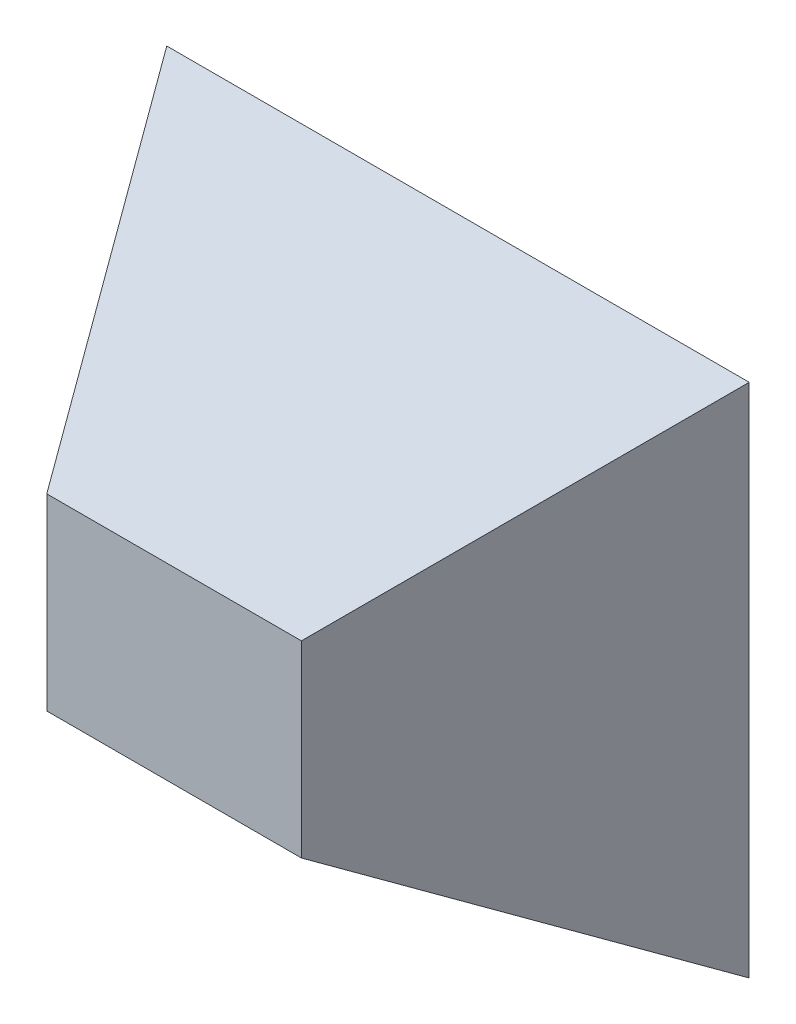
ISO-10303-21;
HEADER;
FILE_DESCRIPTION(('STEP AP214'),'2;1');
FILE_NAME('part.step','',(''),(''),'','','');
FILE_SCHEMA(('AUTOMOTIVE_DESIGN { 1 0 10303 214 1 1 1 1 }'));
ENDSEC;
DATA;
#1=APPLICATION_CONTEXT('core data for automotive mechanical design processes');
#2=APPLICATION_PROTOCOL_DEFINITION('international standard','automotive_design',2000,#1);
#3=PRODUCT_CONTEXT('',#1,'mechanical');
#4=PRODUCT('Part','Part','',(#3));
#5=PRODUCT_RELATED_PRODUCT_CATEGORY('part','',(#4));
#6=PRODUCT_DEFINITION_FORMATION('','',#4);
#7=PRODUCT_DEFINITION_CONTEXT('part definition',#1,'design');
#8=PRODUCT_DEFINITION('design','',#6,#7);
#9=PRODUCT_DEFINITION_SHAPE('','',#8);
#10=(LENGTH_UNIT() NAMED_UNIT(*) SI_UNIT(.MILLI.,.METRE.));
#11=(NAMED_UNIT(*) PLANE_ANGLE_UNIT() SI_UNIT($,.RADIAN.));
#12=(NAMED_UNIT(*) SI_UNIT($,.STERADIAN.) SOLID_ANGLE_UNIT());
#13=UNCERTAINTY_MEASURE_WITH_UNIT(LENGTH_MEASURE(1.E-05),#10,'distance_accuracy_value','');
#14=(GEOMETRIC_REPRESENTATION_CONTEXT(3) GLOBAL_UNCERTAINTY_ASSIGNED_CONTEXT((#13)) GLOBAL_UNIT_ASSIGNED_CONTEXT((#10,
#11,#12)) REPRESENTATION_CONTEXT('',''));
#15=CARTESIAN_POINT('',(0.,0.,0.));
#16=DIRECTION('',(0.,0.,1.));
#17=DIRECTION('',(1.,0.,0.));
#18=AXIS2_PLACEMENT_3D('',#15,#16,#17);
#19=CARTESIAN_POINT('',(-175.,-155.,0.));
#20=DIRECTION('',(-0.866025403784438,0.,0.500000000000001));
#21=DIRECTION('',(0.500000000000001,0.,0.866025403784438));
#22=AXIS2_PLACEMENT_3D('',#19,#20,#21);
#23=PLANE('',#22);
#24=DIRECTION('',(0.,-1.,0.));
#25=VECTOR('',#24,1.);
#26=CARTESIAN_POINT('',(-175.,-155.,0.));
#27=LINE('',#26,#25);
#28=CARTESIAN_POINT('',(-175.,155.,0.));
#29=VERTEX_POINT('',#28);
#30=CARTESIAN_POINT('',(-175.,-155.,0.));
#31=VERTEX_POINT('',#30);
#32=EDGE_CURVE('E125',#29,#31,#27,.T.);
#33=ORIENTED_EDGE('',*,*,#32,.T.);
#34=DIRECTION('',(-0.447213595499959,-0.447213595499959,-0.774596669241482));
#35=VECTOR('',#34,1.);
#36=CARTESIAN_POINT('',(-105.,-84.9999999999998,121.243556529821));
#37=LINE('',#36,#35);
#38=CARTESIAN_POINT('',(-76.5040440762495,-56.5040440762496,170.6));
#39=VERTEX_POINT('',#38);
#40=EDGE_CURVE('E11',#39,#31,#37,.T.);
#41=ORIENTED_EDGE('',*,*,#40,.F.);
#42=DIRECTION('',(0.,1.,0.));
#43=VECTOR('',#42,1.);
#44=CARTESIAN_POINT('',(-76.5040440762495,-155.,170.6));
#45=LINE('',#44,#43);
#46=CARTESIAN_POINT('',(-76.5040440762495,56.5040440762495,170.6));
#47=VERTEX_POINT('',#46);
#48=EDGE_CURVE('E149',#47,#39,#45,.F.);
#49=ORIENTED_EDGE('',*,*,#48,.F.);
#50=DIRECTION('',(-0.447213595499959,0.447213595499959,-0.774596669241483));
#51=VECTOR('',#50,1.);
#52=CARTESIAN_POINT('',(-113.,92.9999999999997,107.38715006927));
#53=LINE('',#52,#51);
#54=EDGE_CURVE('E151',#47,#29,#53,.T.);
#55=ORIENTED_EDGE('',*,*,#54,.T.);
#56=EDGE_LOOP('',(#33,#41,#49,#55));
#57=FACE_BOUND('',#56,.T.);
#58=ADVANCED_FACE('F35',(#57),#23,.T.);
#59=CARTESIAN_POINT('',(175.,-155.,0.));
#60=DIRECTION('',(0.,-0.866025403784438,0.500000000000001));
#61=DIRECTION('',(0.,-0.500000000000001,-0.866025403784438));
#62=AXIS2_PLACEMENT_3D('',#59,#60,#61);
#63=PLANE('',#62);
#64=DIRECTION('',(1.,0.,0.));
#65=VECTOR('',#64,1.);
#66=CARTESIAN_POINT('',(175.,-155.,0.));
#67=LINE('',#66,#65);
#68=CARTESIAN_POINT('',(175.,-155.,0.));
#69=VERTEX_POINT('',#68);
#70=EDGE_CURVE('E129',#31,#69,#67,.T.);
#71=ORIENTED_EDGE('',*,*,#70,.T.);
#72=DIRECTION('',(0.447213595499959,-0.447213595499959,-0.774596669241483));
#73=VECTOR('',#72,1.);
#74=CARTESIAN_POINT('',(175.,-155.,0.));
#75=LINE('',#74,#73);
#76=CARTESIAN_POINT('',(76.5040440762496,-56.5040440762496,170.6));
#77=VERTEX_POINT('',#76);
#78=EDGE_CURVE('E44',#77,#69,#75,.T.);
#79=ORIENTED_EDGE('',*,*,#78,.F.);
#80=DIRECTION('',(-1.,0.,0.));
#81=VECTOR('',#80,1.);
#82=CARTESIAN_POINT('',(175.,-56.5040440762496,170.6));
#83=LINE('',#82,#81);
#84=EDGE_CURVE('E160',#39,#77,#83,.F.);
#85=ORIENTED_EDGE('',*,*,#84,.F.);
#86=ORIENTED_EDGE('',*,*,#40,.T.);
#87=EDGE_LOOP('',(#71,#79,#85,#86));
#88=FACE_BOUND('',#87,.T.);
#89=ADVANCED_FACE('F37',(#88),#63,.T.);
#90=CARTESIAN_POINT('',(175.,-155.,0.));
#91=DIRECTION('',(0.866025403784438,0.,0.500000000000001));
#92=DIRECTION('',(0.500000000000001,0.,-0.866025403784438));
#93=AXIS2_PLACEMENT_3D('',#90,#91,#92);
#94=PLANE('',#93);
#95=DIRECTION('',(0.,1.,0.));
#96=VECTOR('',#95,1.);
#97=CARTESIAN_POINT('',(175.,-155.,0.));
#98=LINE('',#97,#96);
#99=CARTESIAN_POINT('',(175.,155.,0.));
#100=VERTEX_POINT('',#99);
#101=EDGE_CURVE('E146',#69,#100,#98,.T.);
#102=ORIENTED_EDGE('',*,*,#101,.T.);
#103=DIRECTION('',(0.447213595499959,0.447213595499959,-0.774596669241482));
#104=VECTOR('',#103,1.);
#105=CARTESIAN_POINT('',(175.,155.,0.));
#106=LINE('',#105,#104);
#107=CARTESIAN_POINT('',(76.5040440762496,56.5040440762496,170.6));
#108=VERTEX_POINT('',#107);
#109=EDGE_CURVE('E154',#108,#100,#106,.T.);
#110=ORIENTED_EDGE('',*,*,#109,.F.);
#111=DIRECTION('',(0.,-1.,0.));
#112=VECTOR('',#111,1.);
#113=CARTESIAN_POINT('',(76.5040440762496,-155.,170.6));
#114=LINE('',#113,#112);
#115=EDGE_CURVE('E161',#77,#108,#114,.F.);
#116=ORIENTED_EDGE('',*,*,#115,.F.);
#117=ORIENTED_EDGE('',*,*,#78,.T.);
#118=EDGE_LOOP('',(#102,#110,#116,#117));
#119=FACE_BOUND('',#118,.T.);
#120=ADVANCED_FACE('F167',(#119),#94,.T.);
#121=CARTESIAN_POINT('',(175.,155.,0.));
#122=DIRECTION('',(0.,0.866025403784438,0.500000000000001));
#123=DIRECTION('',(0.,-0.500000000000001,0.866025403784438));
#124=AXIS2_PLACEMENT_3D('',#121,#122,#123);
#125=PLANE('',#124);
#126=DIRECTION('',(-1.,0.,0.));
#127=VECTOR('',#126,1.);
#128=CARTESIAN_POINT('',(175.,155.,0.));
#129=LINE('',#128,#127);
#130=EDGE_CURVE('E148',#100,#29,#129,.T.);
#131=ORIENTED_EDGE('',*,*,#130,.T.);
#132=ORIENTED_EDGE('',*,*,#54,.F.);
#133=DIRECTION('',(1.,0.,0.));
#134=VECTOR('',#133,1.);
#135=CARTESIAN_POINT('',(175.,56.5040440762496,170.6));
#136=LINE('',#135,#134);
#137=EDGE_CURVE('E39',#108,#47,#136,.F.);
#138=ORIENTED_EDGE('',*,*,#137,.F.);
#139=ORIENTED_EDGE('',*,*,#109,.T.);
#140=EDGE_LOOP('',(#131,#132,#138,#139));
#141=FACE_BOUND('',#140,.T.);
#142=ADVANCED_FACE('F171',(#141),#125,.T.);
#143=CARTESIAN_POINT('',(0.,0.,170.6));
#144=DIRECTION('',(0.,0.,1.));
#145=DIRECTION('',(1.,0.,0.));
#146=AXIS2_PLACEMENT_3D('',#143,#144,#145);
#147=PLANE('',#146);
#148=ORIENTED_EDGE('',*,*,#48,.T.);
#149=ORIENTED_EDGE('',*,*,#84,.T.);
#150=ORIENTED_EDGE('',*,*,#115,.T.);
#151=ORIENTED_EDGE('',*,*,#137,.T.);
#152=EDGE_LOOP('',(#148,#149,#150,#151));
#153=FACE_BOUND('',#152,.T.);
#154=ADVANCED_FACE('F164',(#153),#147,.T.);
#155=CARTESIAN_POINT('',(0.,0.,0.));
#156=DIRECTION('',(0.,0.,1.));
#157=DIRECTION('',(1.,0.,0.));
#158=AXIS2_PLACEMENT_3D('',#155,#156,#157);
#159=PLANE('',#158);
#160=DIRECTION('',(1.,0.,0.));
#161=VECTOR('',#160,1.);
#162=CARTESIAN_POINT('',(175.,153.071650100907,0.));
#163=LINE('',#162,#161);
#164=CARTESIAN_POINT('',(173.071650100907,153.071650100907,0.));
#165=VERTEX_POINT('',#164);
#166=CARTESIAN_POINT('',(-173.071650100907,153.071650100907,0.));
#167=VERTEX_POINT('',#166);
#168=EDGE_CURVE('E120',#165,#167,#163,.F.);
#169=ORIENTED_EDGE('',*,*,#168,.T.);
#170=DIRECTION('',(0.,1.,0.));
#171=VECTOR('',#170,1.);
#172=CARTESIAN_POINT('',(-173.071650100907,-155.,0.));
#173=LINE('',#172,#171);
#174=CARTESIAN_POINT('',(-173.071650100907,-153.071650100907,0.));
#175=VERTEX_POINT('',#174);
#176=EDGE_CURVE('E139',#167,#175,#173,.F.);
#177=ORIENTED_EDGE('',*,*,#176,.T.);
#178=DIRECTION('',(-1.,0.,0.));
#179=VECTOR('',#178,1.);
#180=CARTESIAN_POINT('',(175.,-153.071650100907,0.));
#181=LINE('',#180,#179);
#182=CARTESIAN_POINT('',(173.071650100907,-153.071650100907,0.));
#183=VERTEX_POINT('',#182);
#184=EDGE_CURVE('E124',#175,#183,#181,.F.);
#185=ORIENTED_EDGE('',*,*,#184,.T.);
#186=DIRECTION('',(0.,-1.,0.));
#187=VECTOR('',#186,1.);
#188=CARTESIAN_POINT('',(173.071650100907,-155.,0.));
#189=LINE('',#188,#187);
#190=EDGE_CURVE('E52',#183,#165,#189,.F.);
#191=ORIENTED_EDGE('',*,*,#190,.T.);
#192=EDGE_LOOP('',(#169,#177,#185,#191));
#193=FACE_BOUND('',#192,.T.);
#194=ORIENTED_EDGE('',*,*,#32,.F.);
#195=ORIENTED_EDGE('',*,*,#130,.F.);
#196=ORIENTED_EDGE('',*,*,#101,.F.);
#197=ORIENTED_EDGE('',*,*,#70,.F.);
#198=EDGE_LOOP('',(#194,#195,#196,#197));
#199=FACE_BOUND('',#198,.T.);
#200=ADVANCED_FACE('F178',(#193,#199),#159,.F.);
#201=CARTESIAN_POINT('',(-173.55373757568,-155.,-0.835000000000002));
#202=DIRECTION('',(-0.866025403784438,0.,0.500000000000001));
#203=DIRECTION('',(0.500000000000001,0.,0.866025403784438));
#204=AXIS2_PLACEMENT_3D('',#201,#202,#203);
#205=PLANE('',#204);
#206=ORIENTED_EDGE('',*,*,#176,.F.);
#207=DIRECTION('',(-0.447213595499959,0.447213595499959,-0.774596669241483));
#208=VECTOR('',#207,1.);
#209=CARTESIAN_POINT('',(-111.842990060544,91.8429900605438,106.05115006927));
#210=LINE('',#209,#208);
#211=CARTESIAN_POINT('',(-75.5398691267029,55.5398691267029,168.93));
#212=VERTEX_POINT('',#211);
#213=EDGE_CURVE('E119',#212,#167,#210,.T.);
#214=ORIENTED_EDGE('',*,*,#213,.F.);
#215=DIRECTION('',(0.,1.,0.));
#216=VECTOR('',#215,1.);
#217=CARTESIAN_POINT('',(-75.5398691267029,-155.,168.93));
#218=LINE('',#217,#216);
#219=CARTESIAN_POINT('',(-75.5398691267029,-55.539869126703,168.93));
#220=VERTEX_POINT('',#219);
#221=EDGE_CURVE('E107',#212,#220,#218,.F.);
#222=ORIENTED_EDGE('',*,*,#221,.T.);
#223=DIRECTION('',(-0.447213595499959,-0.447213595499959,-0.774596669241482));
#224=VECTOR('',#223,1.);
#225=CARTESIAN_POINT('',(-103.842990060544,-83.8429900605438,119.907556529821));
#226=LINE('',#225,#224);
#227=EDGE_CURVE('E117',#220,#175,#226,.T.);
#228=ORIENTED_EDGE('',*,*,#227,.T.);
#229=EDGE_LOOP('',(#206,#214,#222,#228));
#230=FACE_BOUND('',#229,.T.);
#231=ADVANCED_FACE('F116',(#230),#205,.F.);
#232=CARTESIAN_POINT('',(175.,-153.55373757568,-0.835000000000002));
#233=DIRECTION('',(0.,-0.866025403784438,0.500000000000001));
#234=DIRECTION('',(0.,-0.500000000000001,-0.866025403784438));
#235=AXIS2_PLACEMENT_3D('',#232,#233,#234);
#236=PLANE('',#235);
#237=ORIENTED_EDGE('',*,*,#184,.F.);
#238=ORIENTED_EDGE('',*,*,#227,.F.);
#239=DIRECTION('',(-1.,0.,0.));
#240=VECTOR('',#239,1.);
#241=CARTESIAN_POINT('',(175.,-55.5398691267029,168.93));
#242=LINE('',#241,#240);
#243=CARTESIAN_POINT('',(75.5398691267029,-55.5398691267029,168.93));
#244=VERTEX_POINT('',#243);
#245=EDGE_CURVE('E103',#220,#244,#242,.F.);
#246=ORIENTED_EDGE('',*,*,#245,.T.);
#247=DIRECTION('',(0.447213595499959,-0.447213595499959,-0.774596669241483));
#248=VECTOR('',#247,1.);
#249=CARTESIAN_POINT('',(173.842990060544,-153.842990060544,-1.336));
#250=LINE('',#249,#248);
#251=EDGE_CURVE('E126',#244,#183,#250,.T.);
#252=ORIENTED_EDGE('',*,*,#251,.T.);
#253=EDGE_LOOP('',(#237,#238,#246,#252));
#254=FACE_BOUND('',#253,.T.);
#255=ADVANCED_FACE('F122',(#254),#236,.F.);
#256=CARTESIAN_POINT('',(173.55373757568,-155.,-0.835000000000002));
#257=DIRECTION('',(0.866025403784438,0.,0.500000000000001));
#258=DIRECTION('',(0.500000000000001,0.,-0.866025403784438));
#259=AXIS2_PLACEMENT_3D('',#256,#257,#258);
#260=PLANE('',#259);
#261=ORIENTED_EDGE('',*,*,#190,.F.);
#262=ORIENTED_EDGE('',*,*,#251,.F.);
#263=DIRECTION('',(0.,-1.,0.));
#264=VECTOR('',#263,1.);
#265=CARTESIAN_POINT('',(75.5398691267029,-155.,168.93));
#266=LINE('',#265,#264);
#267=CARTESIAN_POINT('',(75.5398691267029,55.5398691267029,168.93));
#268=VERTEX_POINT('',#267);
#269=EDGE_CURVE('E108',#244,#268,#266,.F.);
#270=ORIENTED_EDGE('',*,*,#269,.T.);
#271=DIRECTION('',(0.447213595499959,0.447213595499959,-0.774596669241482));
#272=VECTOR('',#271,1.);
#273=CARTESIAN_POINT('',(173.842990060544,153.842990060544,-1.336));
#274=LINE('',#273,#272);
#275=EDGE_CURVE('E131',#268,#165,#274,.T.);
#276=ORIENTED_EDGE('',*,*,#275,.T.);
#277=EDGE_LOOP('',(#261,#262,#270,#276));
#278=FACE_BOUND('',#277,.T.);
#279=ADVANCED_FACE('F227',(#278),#260,.F.);
#280=CARTESIAN_POINT('',(175.,153.55373757568,-0.835000000000002));
#281=DIRECTION('',(0.,0.866025403784438,0.500000000000001));
#282=DIRECTION('',(0.,-0.500000000000001,0.866025403784438));
#283=AXIS2_PLACEMENT_3D('',#280,#281,#282);
#284=PLANE('',#283);
#285=ORIENTED_EDGE('',*,*,#168,.F.);
#286=ORIENTED_EDGE('',*,*,#275,.F.);
#287=DIRECTION('',(1.,0.,0.));
#288=VECTOR('',#287,1.);
#289=CARTESIAN_POINT('',(175.,55.5398691267029,168.93));
#290=LINE('',#289,#288);
#291=EDGE_CURVE('E134',#268,#212,#290,.F.);
#292=ORIENTED_EDGE('',*,*,#291,.T.);
#293=ORIENTED_EDGE('',*,*,#213,.T.);
#294=EDGE_LOOP('',(#285,#286,#292,#293));
#295=FACE_BOUND('',#294,.T.);
#296=ADVANCED_FACE('F236',(#295),#284,.F.);
#297=CARTESIAN_POINT('',(0.,0.,168.93));
#298=DIRECTION('',(0.,0.,1.));
#299=DIRECTION('',(1.,0.,0.));
#300=AXIS2_PLACEMENT_3D('',#297,#298,#299);
#301=PLANE('',#300);
#302=ORIENTED_EDGE('',*,*,#221,.F.);
#303=ORIENTED_EDGE('',*,*,#291,.F.);
#304=ORIENTED_EDGE('',*,*,#269,.F.);
#305=ORIENTED_EDGE('',*,*,#245,.F.);
#306=EDGE_LOOP('',(#302,#303,#304,#305));
#307=FACE_BOUND('',#306,.T.);
#308=ADVANCED_FACE('F105',(#307),#301,.F.);
#309=CLOSED_SHELL('',(#58,#89,#120,#142,#154,#200,#231,#255,#279,#296,#308));
#310=MANIFOLD_SOLID_BREP('B2',#309);
#311=ADVANCED_BREP_SHAPE_REPRESENTATION('',(#18,#310),#14);
#312=SHAPE_DEFINITION_REPRESENTATION(#9,#311);
ENDSEC;
END-ISO-10303-21;
